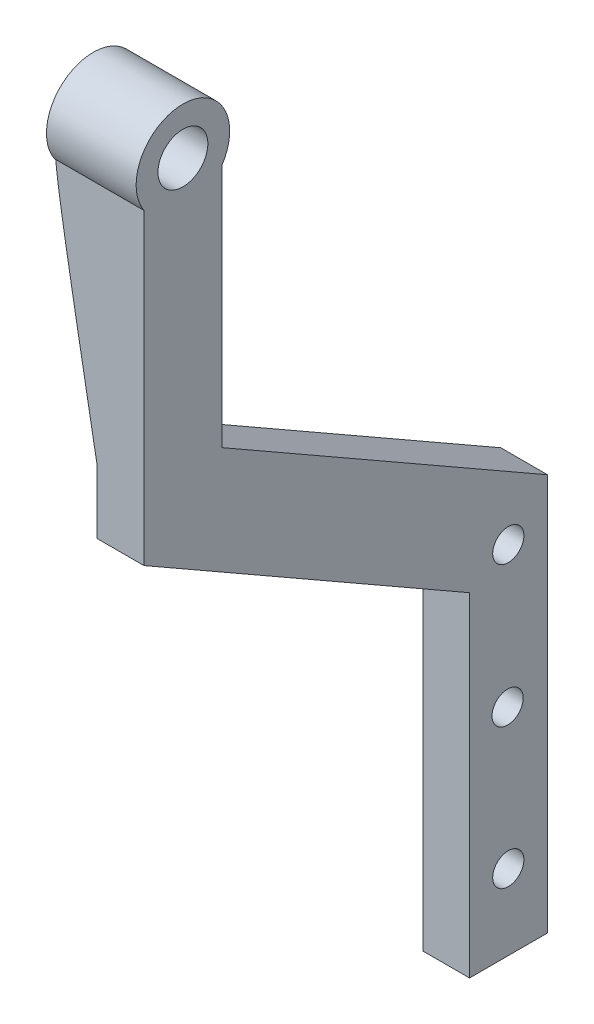
ISO-10303-21;
HEADER;
FILE_DESCRIPTION(('STEP AP214'),'2;1');
FILE_NAME('part.step','',(''),(''),'','','');
FILE_SCHEMA(('AUTOMOTIVE_DESIGN { 1 0 10303 214 1 1 1 1 }'));
ENDSEC;
DATA;
#1=APPLICATION_CONTEXT('core data for automotive mechanical design processes');
#2=APPLICATION_PROTOCOL_DEFINITION('international standard','automotive_design',2000,#1);
#3=PRODUCT_CONTEXT('',#1,'mechanical');
#4=PRODUCT('Part','Part','',(#3));
#5=PRODUCT_RELATED_PRODUCT_CATEGORY('part','',(#4));
#6=PRODUCT_DEFINITION_FORMATION('','',#4);
#7=PRODUCT_DEFINITION_CONTEXT('part definition',#1,'design');
#8=PRODUCT_DEFINITION('design','',#6,#7);
#9=PRODUCT_DEFINITION_SHAPE('','',#8);
#10=(LENGTH_UNIT() NAMED_UNIT(*) SI_UNIT(.MILLI.,.METRE.));
#11=(NAMED_UNIT(*) PLANE_ANGLE_UNIT() SI_UNIT($,.RADIAN.));
#12=(NAMED_UNIT(*) SI_UNIT($,.STERADIAN.) SOLID_ANGLE_UNIT());
#13=UNCERTAINTY_MEASURE_WITH_UNIT(LENGTH_MEASURE(1.E-05),#10,'distance_accuracy_value','');
#14=(GEOMETRIC_REPRESENTATION_CONTEXT(3) GLOBAL_UNCERTAINTY_ASSIGNED_CONTEXT((#13)) GLOBAL_UNIT_ASSIGNED_CONTEXT((#10,
#11,#12)) REPRESENTATION_CONTEXT('',''));
#15=CARTESIAN_POINT('',(0.,0.,0.));
#16=DIRECTION('',(0.,0.,1.));
#17=DIRECTION('',(1.,0.,0.));
#18=AXIS2_PLACEMENT_3D('',#15,#16,#17);
#19=CARTESIAN_POINT('',(25.7,0.,0.));
#20=DIRECTION('',(-1.,0.,0.));
#21=DIRECTION('',(0.,-1.,0.));
#22=AXIS2_PLACEMENT_3D('',#19,#20,#21);
#23=PLANE('',#22);
#24=CARTESIAN_POINT('',(25.7,0.,0.));
#25=DIRECTION('',(-1.,0.,0.));
#26=DIRECTION('',(0.,0.,1.));
#27=AXIS2_PLACEMENT_3D('',#24,#25,#26);
#28=CIRCLE('',#27,1.6);
#29=CARTESIAN_POINT('',(25.7,0.,1.6));
#30=VERTEX_POINT('',#29);
#31=EDGE_CURVE('E463',#30,#30,#28,.F.);
#32=ORIENTED_EDGE('',*,*,#31,.F.);
#33=EDGE_LOOP('',(#32));
#34=FACE_BOUND('',#33,.T.);
#35=CARTESIAN_POINT('',(25.7,-40.9017540160754,-20.8240395942605));
#36=DIRECTION('',(1.,0.,0.));
#37=DIRECTION('',(0.,-1.,0.));
#38=AXIS2_PLACEMENT_3D('',#35,#36,#37);
#39=CIRCLE('',#38,1.);
#40=CARTESIAN_POINT('',(25.7,-41.9017540160754,-20.8240395942605));
#41=VERTEX_POINT('',#40);
#42=EDGE_CURVE('E57',#41,#41,#39,.T.);
#43=ORIENTED_EDGE('',*,*,#42,.F.);
#44=EDGE_LOOP('',(#43));
#45=FACE_BOUND('',#44,.T.);
#46=CARTESIAN_POINT('',(25.7,-31.9018561460723,-20.8669153393056));
#47=DIRECTION('',(1.,0.,0.));
#48=DIRECTION('',(0.,-1.,0.));
#49=AXIS2_PLACEMENT_3D('',#46,#47,#48);
#50=CIRCLE('',#49,1.);
#51=CARTESIAN_POINT('',(25.7,-32.9018561460723,-20.8669153393056));
#52=VERTEX_POINT('',#51);
#53=EDGE_CURVE('E207',#52,#52,#50,.T.);
#54=ORIENTED_EDGE('',*,*,#53,.F.);
#55=EDGE_LOOP('',(#54));
#56=FACE_BOUND('',#55,.T.);
#57=CARTESIAN_POINT('',(25.7,-49.9016518860785,-20.8669153393056));
#58=DIRECTION('',(1.,0.,0.));
#59=DIRECTION('',(0.,-1.,0.));
#60=AXIS2_PLACEMENT_3D('',#57,#58,#59);
#61=CIRCLE('',#60,1.);
#62=CARTESIAN_POINT('',(25.7,-50.9016518860785,-20.8669153393056));
#63=VERTEX_POINT('',#62);
#64=EDGE_CURVE('E204',#63,#63,#61,.T.);
#65=ORIENTED_EDGE('',*,*,#64,.F.);
#66=EDGE_LOOP('',(#65));
#67=FACE_BOUND('',#66,.T.);
#68=DIRECTION('',(0.,-1.,0.));
#69=VECTOR('',#68,1.);
#70=CARTESIAN_POINT('',(25.7,0.,-2.5));
#71=LINE('',#70,#69);
#72=CARTESIAN_POINT('',(25.7,-1.6583123951777,-2.5));
#73=VERTEX_POINT('',#72);
#74=CARTESIAN_POINT('',(25.7,-17.3327342160877,-2.5));
#75=VERTEX_POINT('',#74);
#76=EDGE_CURVE('E50',#73,#75,#71,.T.);
#77=ORIENTED_EDGE('',*,*,#76,.F.);
#78=CARTESIAN_POINT('',(25.7,0.,0.));
#79=DIRECTION('',(-1.,0.,0.));
#80=DIRECTION('',(0.,0.,1.));
#81=AXIS2_PLACEMENT_3D('',#78,#79,#80);
#82=CIRCLE('',#81,3.);
#83=CARTESIAN_POINT('',(25.7,-1.6583123951777,2.5));
#84=VERTEX_POINT('',#83);
#85=EDGE_CURVE('E137',#73,#84,#82,.F.);
#86=ORIENTED_EDGE('',*,*,#85,.T.);
#87=DIRECTION('',(0.,-1.,0.));
#88=VECTOR('',#87,1.);
#89=CARTESIAN_POINT('',(25.7,0.,2.5));
#90=LINE('',#89,#88);
#91=CARTESIAN_POINT('',(25.7,-21.3847039769324,2.5));
#92=VERTEX_POINT('',#91);
#93=EDGE_CURVE('E73',#84,#92,#90,.T.);
#94=ORIENTED_EDGE('',*,*,#93,.T.);
#95=DIRECTION('',(0.,-0.496590024697171,-0.867985223014345));
#96=VECTOR('',#95,1.);
#97=CARTESIAN_POINT('',(25.7,-21.3847039769324,2.5));
#98=LINE('',#97,#96);
#99=CARTESIAN_POINT('',(25.7,-33.3326333912585,-18.3836780069791));
#100=VERTEX_POINT('',#99);
#101=EDGE_CURVE('E197',#92,#100,#98,.T.);
#102=ORIENTED_EDGE('',*,*,#101,.T.);
#103=DIRECTION('',(0.,-0.999999997476666,7.10399085624933E-05));
#104=VECTOR('',#103,1.);
#105=CARTESIAN_POINT('',(25.7,-33.3326333912585,-18.3836780069791));
#106=LINE('',#105,#104);
#107=CARTESIAN_POINT('',(25.7,-54.7309993874838,-18.3821578690115));
#108=VERTEX_POINT('',#107);
#109=EDGE_CURVE('E234',#100,#108,#106,.T.);
#110=ORIENTED_EDGE('',*,*,#109,.T.);
#111=DIRECTION('',(0.,-7.10399085587182E-05,-0.999999997476666));
#112=VECTOR('',#111,1.);
#113=CARTESIAN_POINT('',(25.7,-54.7309993874838,-18.3821578690115));
#114=LINE('',#113,#112);
#115=CARTESIAN_POINT('',(25.7,-54.7313545870266,-23.3821578563717));
#116=VERTEX_POINT('',#115);
#117=EDGE_CURVE('E236',#108,#116,#114,.T.);
#118=ORIENTED_EDGE('',*,*,#117,.T.);
#119=DIRECTION('',(0.,0.999999997476666,-7.10399089843637E-05));
#120=VECTOR('',#119,1.);
#121=CARTESIAN_POINT('',(25.7,-54.7313545870266,-23.3821578563717));
#122=LINE('',#121,#120);
#123=CARTESIAN_POINT('',(25.7,-29.2808283160098,-23.3839658594462));
#124=VERTEX_POINT('',#123);
#125=EDGE_CURVE('E239',#116,#124,#122,.T.);
#126=ORIENTED_EDGE('',*,*,#125,.T.);
#127=DIRECTION('',(0.,-0.496590024697171,-0.867985223014345));
#128=VECTOR('',#127,1.);
#129=CARTESIAN_POINT('',(25.7,-17.3327342160877,-2.5));
#130=LINE('',#129,#128);
#131=EDGE_CURVE('E228',#75,#124,#130,.T.);
#132=ORIENTED_EDGE('',*,*,#131,.F.);
#133=EDGE_LOOP('',(#77,#86,#94,#102,#110,#118,#126,#132));
#134=FACE_BOUND('',#133,.T.);
#135=ADVANCED_FACE('F47',(#34,#45,#56,#67,#134),#23,.F.);
#136=CARTESIAN_POINT('',(22.7,0.,0.));
#137=DIRECTION('',(-1.,0.,0.));
#138=DIRECTION('',(0.,-1.,0.));
#139=AXIS2_PLACEMENT_3D('',#136,#137,#138);
#140=PLANE('',#139);
#141=CARTESIAN_POINT('',(22.7,-40.9017540160754,-20.8240395942605));
#142=DIRECTION('',(1.,0.,0.));
#143=DIRECTION('',(0.,-1.,0.));
#144=AXIS2_PLACEMENT_3D('',#141,#142,#143);
#145=CIRCLE('',#144,1.);
#146=CARTESIAN_POINT('',(22.7,-41.9017540160754,-20.8240395942605));
#147=VERTEX_POINT('',#146);
#148=EDGE_CURVE('E244',#147,#147,#145,.T.);
#149=ORIENTED_EDGE('',*,*,#148,.T.);
#150=EDGE_LOOP('',(#149));
#151=FACE_BOUND('',#150,.T.);
#152=CARTESIAN_POINT('',(22.7,-31.9018561460723,-20.8669153393056));
#153=DIRECTION('',(1.,0.,0.));
#154=DIRECTION('',(0.,-1.,0.));
#155=AXIS2_PLACEMENT_3D('',#152,#153,#154);
#156=CIRCLE('',#155,1.);
#157=CARTESIAN_POINT('',(22.7,-32.9018561460723,-20.8669153393056));
#158=VERTEX_POINT('',#157);
#159=EDGE_CURVE('E248',#158,#158,#156,.T.);
#160=ORIENTED_EDGE('',*,*,#159,.T.);
#161=EDGE_LOOP('',(#160));
#162=FACE_BOUND('',#161,.T.);
#163=CARTESIAN_POINT('',(22.7,-49.9016518860785,-20.8669153393056));
#164=DIRECTION('',(1.,0.,0.));
#165=DIRECTION('',(0.,-1.,0.));
#166=AXIS2_PLACEMENT_3D('',#163,#164,#165);
#167=CIRCLE('',#166,1.);
#168=CARTESIAN_POINT('',(22.7,-50.9016518860785,-20.8669153393056));
#169=VERTEX_POINT('',#168);
#170=EDGE_CURVE('E252',#169,#169,#167,.T.);
#171=ORIENTED_EDGE('',*,*,#170,.T.);
#172=EDGE_LOOP('',(#171));
#173=FACE_BOUND('',#172,.T.);
#174=CARTESIAN_POINT('',(22.7,0.,0.));
#175=DIRECTION('',(-1.,0.,0.));
#176=DIRECTION('',(0.,-1.,0.));
#177=AXIS2_PLACEMENT_3D('',#174,#175,#176);
#178=CIRCLE('',#177,17.5);
#179=CARTESIAN_POINT('',(22.7,-17.3205080756888,-2.5));
#180=VERTEX_POINT('',#179);
#181=CARTESIAN_POINT('',(22.7,-17.3205080756888,2.5));
#182=VERTEX_POINT('',#181);
#183=EDGE_CURVE('E126',#180,#182,#178,.T.);
#184=ORIENTED_EDGE('',*,*,#183,.F.);
#185=DIRECTION('',(0.,-1.,0.));
#186=VECTOR('',#185,1.);
#187=CARTESIAN_POINT('',(22.7,0.,-2.5));
#188=LINE('',#187,#186);
#189=CARTESIAN_POINT('',(22.7,-17.3327342160877,-2.5));
#190=VERTEX_POINT('',#189);
#191=EDGE_CURVE('E258',#180,#190,#188,.T.);
#192=ORIENTED_EDGE('',*,*,#191,.T.);
#193=DIRECTION('',(0.,-0.496590024697171,-0.867985223014345));
#194=VECTOR('',#193,1.);
#195=CARTESIAN_POINT('',(22.7,-17.3327342160877,-2.5));
#196=LINE('',#195,#194);
#197=CARTESIAN_POINT('',(22.7,-29.2808283160098,-23.3839658594462));
#198=VERTEX_POINT('',#197);
#199=EDGE_CURVE('E261',#190,#198,#196,.T.);
#200=ORIENTED_EDGE('',*,*,#199,.T.);
#201=DIRECTION('',(0.,-0.999999997476666,7.10399089843637E-05));
#202=VECTOR('',#201,1.);
#203=CARTESIAN_POINT('',(22.7,-54.7313545870266,-23.3821578563717));
#204=LINE('',#203,#202);
#205=CARTESIAN_POINT('',(22.7,-54.7313545870266,-23.3821578563717));
#206=VERTEX_POINT('',#205);
#207=EDGE_CURVE('E264',#198,#206,#204,.T.);
#208=ORIENTED_EDGE('',*,*,#207,.T.);
#209=DIRECTION('',(0.,7.10399085587182E-05,0.999999997476666));
#210=VECTOR('',#209,1.);
#211=CARTESIAN_POINT('',(22.7,-54.7309993874838,-18.3821578690115));
#212=LINE('',#211,#210);
#213=CARTESIAN_POINT('',(22.7,-54.7309993874838,-18.3821578690115));
#214=VERTEX_POINT('',#213);
#215=EDGE_CURVE('E267',#206,#214,#212,.T.);
#216=ORIENTED_EDGE('',*,*,#215,.T.);
#217=DIRECTION('',(0.,0.999999997476666,-7.10399085624933E-05));
#218=VECTOR('',#217,1.);
#219=CARTESIAN_POINT('',(22.7,-33.3326333912585,-18.3836780069791));
#220=LINE('',#219,#218);
#221=CARTESIAN_POINT('',(22.7,-33.3326333912585,-18.3836780069791));
#222=VERTEX_POINT('',#221);
#223=EDGE_CURVE('E270',#214,#222,#220,.T.);
#224=ORIENTED_EDGE('',*,*,#223,.T.);
#225=DIRECTION('',(0.,0.496590024697171,0.867985223014345));
#226=VECTOR('',#225,1.);
#227=CARTESIAN_POINT('',(22.7,-21.3847039769324,2.5));
#228=LINE('',#227,#226);
#229=CARTESIAN_POINT('',(22.7,-21.3847039769324,2.5));
#230=VERTEX_POINT('',#229);
#231=EDGE_CURVE('E273',#222,#230,#228,.T.);
#232=ORIENTED_EDGE('',*,*,#231,.T.);
#233=DIRECTION('',(0.,1.,0.));
#234=VECTOR('',#233,1.);
#235=CARTESIAN_POINT('',(22.7,0.,2.5));
#236=LINE('',#235,#234);
#237=EDGE_CURVE('E276',#230,#182,#236,.T.);
#238=ORIENTED_EDGE('',*,*,#237,.T.);
#239=EDGE_LOOP('',(#184,#192,#200,#208,#216,#224,#232,#238));
#240=FACE_BOUND('',#239,.T.);
#241=ADVANCED_FACE('F221',(#151,#162,#173,#240),#140,.T.);
#242=CARTESIAN_POINT('',(25.7,0.,-2.5));
#243=DIRECTION('',(0.,0.,-1.));
#244=DIRECTION('',(0.,-1.,0.));
#245=AXIS2_PLACEMENT_3D('',#242,#243,#244);
#246=PLANE('',#245);
#247=DIRECTION('',(-1.,0.,0.));
#248=VECTOR('',#247,1.);
#249=CARTESIAN_POINT('',(34.1852813742386,-1.6583123951777,-2.5));
#250=LINE('',#249,#248);
#251=CARTESIAN_POINT('',(20.0416666666667,-1.6583123951777,-2.5));
#252=VERTEX_POINT('',#251);
#253=EDGE_CURVE('E65',#73,#252,#250,.T.);
#254=ORIENTED_EDGE('',*,*,#253,.F.);
#255=ORIENTED_EDGE('',*,*,#76,.T.);
#256=DIRECTION('',(-1.,0.,0.));
#257=VECTOR('',#256,1.);
#258=CARTESIAN_POINT('',(25.7,-17.3327342160877,-2.5));
#259=LINE('',#258,#257);
#260=EDGE_CURVE('E186',#75,#190,#259,.T.);
#261=ORIENTED_EDGE('',*,*,#260,.T.);
#262=ORIENTED_EDGE('',*,*,#191,.F.);
#263=CARTESIAN_POINT('',(19.95,0.,-2.5));
#264=CARTESIAN_POINT('',(19.95,-2.16506350946119,-2.5));
#265=CARTESIAN_POINT('',(22.7,-17.3205080756888,-2.5));
#266=(BOUNDED_CURVE() B_SPLINE_CURVE(2,(#263,#264,#265),.UNSPECIFIED.,.F.,
.F.) B_SPLINE_CURVE_WITH_KNOTS((3,3),(1.75452879508612,3.50905759017224),
.UNSPECIFIED.) CURVE() GEOMETRIC_REPRESENTATION_ITEM() RATIONAL_B_SPLINE_CURVE((1.,
1.99999999999986,1.)) REPRESENTATION_ITEM(''));
#267=EDGE_CURVE('E179',#252,#180,#266,.T.);
#268=ORIENTED_EDGE('',*,*,#267,.F.);
#269=EDGE_LOOP('',(#254,#255,#261,#262,#268));
#270=FACE_BOUND('',#269,.T.);
#271=ADVANCED_FACE('F282',(#270),#246,.T.);
#272=CARTESIAN_POINT('',(25.7,-17.3327342160877,-2.5));
#273=DIRECTION('',(0.,0.867985223014345,-0.496590024697171));
#274=DIRECTION('',(0.,-0.496590024697171,-0.867985223014345));
#275=AXIS2_PLACEMENT_3D('',#272,#273,#274);
#276=PLANE('',#275);
#277=ORIENTED_EDGE('',*,*,#131,.T.);
#278=DIRECTION('',(-1.,0.,0.));
#279=VECTOR('',#278,1.);
#280=CARTESIAN_POINT('',(25.7,-29.2808283160098,-23.3839658594462));
#281=LINE('',#280,#279);
#282=EDGE_CURVE('E173',#124,#198,#281,.T.);
#283=ORIENTED_EDGE('',*,*,#282,.T.);
#284=ORIENTED_EDGE('',*,*,#199,.F.);
#285=ORIENTED_EDGE('',*,*,#260,.F.);
#286=EDGE_LOOP('',(#277,#283,#284,#285));
#287=FACE_BOUND('',#286,.T.);
#288=ADVANCED_FACE('F284',(#287),#276,.T.);
#289=CARTESIAN_POINT('',(25.7,-29.2808283160098,-23.3839658594462));
#290=DIRECTION('',(0.,-7.10399089843637E-05,-0.999999997476666));
#291=DIRECTION('',(0.,-0.999999997476666,7.10399089843637E-05));
#292=AXIS2_PLACEMENT_3D('',#289,#290,#291);
#293=PLANE('',#292);
#294=ORIENTED_EDGE('',*,*,#125,.F.);
#295=DIRECTION('',(-1.,0.,0.));
#296=VECTOR('',#295,1.);
#297=CARTESIAN_POINT('',(25.7,-54.7313545870266,-23.3821578563717));
#298=LINE('',#297,#296);
#299=EDGE_CURVE('E167',#116,#206,#298,.T.);
#300=ORIENTED_EDGE('',*,*,#299,.T.);
#301=ORIENTED_EDGE('',*,*,#207,.F.);
#302=ORIENTED_EDGE('',*,*,#282,.F.);
#303=EDGE_LOOP('',(#294,#300,#301,#302));
#304=FACE_BOUND('',#303,.T.);
#305=ADVANCED_FACE('F305',(#304),#293,.T.);
#306=CARTESIAN_POINT('',(25.7,-54.7313545870266,-23.3821578563717));
#307=DIRECTION('',(0.,-0.999999997476666,7.10399085587182E-05));
#308=DIRECTION('',(0.,7.10399085587182E-05,0.999999997476666));
#309=AXIS2_PLACEMENT_3D('',#306,#307,#308);
#310=PLANE('',#309);
#311=ORIENTED_EDGE('',*,*,#117,.F.);
#312=DIRECTION('',(-1.,0.,0.));
#313=VECTOR('',#312,1.);
#314=CARTESIAN_POINT('',(25.7,-54.7309993874838,-18.3821578690115));
#315=LINE('',#314,#313);
#316=EDGE_CURVE('E161',#108,#214,#315,.T.);
#317=ORIENTED_EDGE('',*,*,#316,.T.);
#318=ORIENTED_EDGE('',*,*,#215,.F.);
#319=ORIENTED_EDGE('',*,*,#299,.F.);
#320=EDGE_LOOP('',(#311,#317,#318,#319));
#321=FACE_BOUND('',#320,.T.);
#322=ADVANCED_FACE('F301',(#321),#310,.T.);
#323=CARTESIAN_POINT('',(25.7,-54.7309993874838,-18.3821578690115));
#324=DIRECTION('',(0.,7.10399085624933E-05,0.999999997476666));
#325=DIRECTION('',(0.,0.999999997476666,-7.10399085624933E-05));
#326=AXIS2_PLACEMENT_3D('',#323,#324,#325);
#327=PLANE('',#326);
#328=ORIENTED_EDGE('',*,*,#109,.F.);
#329=DIRECTION('',(-1.,0.,0.));
#330=VECTOR('',#329,1.);
#331=CARTESIAN_POINT('',(25.7,-33.3326333912585,-18.3836780069791));
#332=LINE('',#331,#330);
#333=EDGE_CURVE('E155',#100,#222,#332,.T.);
#334=ORIENTED_EDGE('',*,*,#333,.T.);
#335=ORIENTED_EDGE('',*,*,#223,.F.);
#336=ORIENTED_EDGE('',*,*,#316,.F.);
#337=EDGE_LOOP('',(#328,#334,#335,#336));
#338=FACE_BOUND('',#337,.T.);
#339=ADVANCED_FACE('F297',(#338),#327,.T.);
#340=CARTESIAN_POINT('',(25.7,-33.3326333912585,-18.3836780069791));
#341=DIRECTION('',(0.,-0.867985223014345,0.496590024697171));
#342=DIRECTION('',(0.,0.496590024697171,0.867985223014345));
#343=AXIS2_PLACEMENT_3D('',#340,#341,#342);
#344=PLANE('',#343);
#345=ORIENTED_EDGE('',*,*,#101,.F.);
#346=DIRECTION('',(-1.,0.,0.));
#347=VECTOR('',#346,1.);
#348=CARTESIAN_POINT('',(25.7,-21.3847039769324,2.5));
#349=LINE('',#348,#347);
#350=EDGE_CURVE('E129',#92,#230,#349,.T.);
#351=ORIENTED_EDGE('',*,*,#350,.T.);
#352=ORIENTED_EDGE('',*,*,#231,.F.);
#353=ORIENTED_EDGE('',*,*,#333,.F.);
#354=EDGE_LOOP('',(#345,#351,#352,#353));
#355=FACE_BOUND('',#354,.T.);
#356=ADVANCED_FACE('F291',(#355),#344,.T.);
#357=CARTESIAN_POINT('',(25.7,-21.3847039769324,2.5));
#358=DIRECTION('',(0.,0.,1.));
#359=DIRECTION('',(0.,1.,0.));
#360=AXIS2_PLACEMENT_3D('',#357,#358,#359);
#361=PLANE('',#360);
#362=DIRECTION('',(-1.,0.,0.));
#363=VECTOR('',#362,1.);
#364=CARTESIAN_POINT('',(34.1852813742386,-1.6583123951777,2.5));
#365=LINE('',#364,#363);
#366=CARTESIAN_POINT('',(20.0416666666667,-1.6583123951777,2.5));
#367=VERTEX_POINT('',#366);
#368=EDGE_CURVE('E131',#367,#84,#365,.F.);
#369=ORIENTED_EDGE('',*,*,#368,.F.);
#370=CARTESIAN_POINT('',(22.7,-17.3205080756888,2.5));
#371=CARTESIAN_POINT('',(19.95,-2.16506350946116,2.5));
#372=CARTESIAN_POINT('',(19.95,0.,2.5));
#373=(BOUNDED_CURVE() B_SPLINE_CURVE(2,(#370,#371,#372),.UNSPECIFIED.,.F.,
.F.) B_SPLINE_CURVE_WITH_KNOTS((3,3),(0.,1.75452879508612),
.UNSPECIFIED.) CURVE() GEOMETRIC_REPRESENTATION_ITEM() RATIONAL_B_SPLINE_CURVE((1.,
1.99999999999984,1.)) REPRESENTATION_ITEM(''));
#374=EDGE_CURVE('E123',#182,#367,#373,.T.);
#375=ORIENTED_EDGE('',*,*,#374,.F.);
#376=ORIENTED_EDGE('',*,*,#237,.F.);
#377=ORIENTED_EDGE('',*,*,#350,.F.);
#378=ORIENTED_EDGE('',*,*,#93,.F.);
#379=EDGE_LOOP('',(#369,#375,#376,#377,#378));
#380=FACE_BOUND('',#379,.T.);
#381=ADVANCED_FACE('F132',(#380),#361,.T.);
#382=CARTESIAN_POINT('',(25.7,-49.9016518860785,-20.8669153393056));
#383=DIRECTION('',(-1.,0.,0.));
#384=DIRECTION('',(0.,-1.,0.));
#385=AXIS2_PLACEMENT_3D('',#382,#383,#384);
#386=CYLINDRICAL_SURFACE('',#385,1.);
#387=ORIENTED_EDGE('',*,*,#64,.T.);
#388=EDGE_LOOP('',(#387));
#389=FACE_BOUND('',#388,.T.);
#390=ORIENTED_EDGE('',*,*,#170,.F.);
#391=EDGE_LOOP('',(#390));
#392=FACE_BOUND('',#391,.T.);
#393=ADVANCED_FACE('F327',(#389,#392),#386,.F.);
#394=CARTESIAN_POINT('',(25.7,-31.9018561460723,-20.8669153393056));
#395=DIRECTION('',(-1.,0.,0.));
#396=DIRECTION('',(0.,-1.,0.));
#397=AXIS2_PLACEMENT_3D('',#394,#395,#396);
#398=CYLINDRICAL_SURFACE('',#397,1.);
#399=ORIENTED_EDGE('',*,*,#53,.T.);
#400=EDGE_LOOP('',(#399));
#401=FACE_BOUND('',#400,.T.);
#402=ORIENTED_EDGE('',*,*,#159,.F.);
#403=EDGE_LOOP('',(#402));
#404=FACE_BOUND('',#403,.T.);
#405=ADVANCED_FACE('F329',(#401,#404),#398,.F.);
#406=CARTESIAN_POINT('',(25.7,-40.9017540160754,-20.8240395942605));
#407=DIRECTION('',(-1.,0.,0.));
#408=DIRECTION('',(0.,-1.,0.));
#409=AXIS2_PLACEMENT_3D('',#406,#407,#408);
#410=CYLINDRICAL_SURFACE('',#409,1.);
#411=ORIENTED_EDGE('',*,*,#42,.T.);
#412=EDGE_LOOP('',(#411));
#413=FACE_BOUND('',#412,.T.);
#414=ORIENTED_EDGE('',*,*,#148,.F.);
#415=EDGE_LOOP('',(#414));
#416=FACE_BOUND('',#415,.T.);
#417=ADVANCED_FACE('F216',(#413,#416),#410,.F.);
#418=CARTESIAN_POINT('',(21.325,0.,0.));
#419=DIRECTION('',(1.,0.,0.));
#420=DIRECTION('',(0.,-1.,0.));
#421=AXIS2_PLACEMENT_3D('',#418,#419,#420);
#422=CONICAL_SURFACE('',#421,10.,1.38947655239341);
#423=CARTESIAN_POINT('',(20.0416666666667,0.,0.));
#424=DIRECTION('',(1.,0.,0.));
#425=DIRECTION('',(0.,0.,-1.));
#426=AXIS2_PLACEMENT_3D('',#423,#424,#425);
#427=CIRCLE('',#426,3.);
#428=EDGE_CURVE('E11',#252,#367,#427,.F.);
#429=ORIENTED_EDGE('',*,*,#428,.F.);
#430=ORIENTED_EDGE('',*,*,#267,.T.);
#431=ORIENTED_EDGE('',*,*,#183,.T.);
#432=ORIENTED_EDGE('',*,*,#374,.T.);
#433=EDGE_LOOP('',(#429,#430,#431,#432));
#434=FACE_BOUND('',#433,.T.);
#435=ADVANCED_FACE('F124',(#434),#422,.T.);
#436=CARTESIAN_POINT('',(34.1852813742386,0.,0.));
#437=DIRECTION('',(-1.,0.,0.));
#438=DIRECTION('',(0.,0.,1.));
#439=AXIS2_PLACEMENT_3D('',#436,#437,#438);
#440=CYLINDRICAL_SURFACE('',#439,3.);
#441=ORIENTED_EDGE('',*,*,#85,.F.);
#442=ORIENTED_EDGE('',*,*,#253,.T.);
#443=ORIENTED_EDGE('',*,*,#428,.T.);
#444=ORIENTED_EDGE('',*,*,#368,.T.);
#445=EDGE_LOOP('',(#441,#442,#443,#444));
#446=FACE_BOUND('',#445,.T.);
#447=CARTESIAN_POINT('',(19.95,0.,0.));
#448=DIRECTION('',(-1.,0.,0.));
#449=DIRECTION('',(0.,0.,1.));
#450=AXIS2_PLACEMENT_3D('',#447,#448,#449);
#451=CIRCLE('',#450,3.);
#452=CARTESIAN_POINT('',(19.95,0.,3.));
#453=VERTEX_POINT('',#452);
#454=EDGE_CURVE('E470',#453,#453,#451,.T.);
#455=ORIENTED_EDGE('',*,*,#454,.F.);
#456=EDGE_LOOP('',(#455));
#457=FACE_BOUND('',#456,.T.);
#458=ADVANCED_FACE('F139',(#446,#457),#440,.T.);
#459=CARTESIAN_POINT('',(19.95,0.,0.));
#460=DIRECTION('',(1.,0.,0.));
#461=DIRECTION('',(0.,1.,0.));
#462=AXIS2_PLACEMENT_3D('',#459,#460,#461);
#463=PLANE('',#462);
#464=CARTESIAN_POINT('',(19.95,0.,0.));
#465=DIRECTION('',(-1.,0.,0.));
#466=DIRECTION('',(0.,0.,1.));
#467=AXIS2_PLACEMENT_3D('',#464,#465,#466);
#468=CIRCLE('',#467,1.6);
#469=CARTESIAN_POINT('',(19.95,0.,1.6));
#470=VERTEX_POINT('',#469);
#471=EDGE_CURVE('E466',#470,#470,#468,.T.);
#472=ORIENTED_EDGE('',*,*,#471,.F.);
#473=EDGE_LOOP('',(#472));
#474=FACE_BOUND('',#473,.T.);
#475=ORIENTED_EDGE('',*,*,#454,.T.);
#476=EDGE_LOOP('',(#475));
#477=FACE_BOUND('',#476,.T.);
#478=ADVANCED_FACE('F379',(#474,#477),#463,.F.);
#479=CARTESIAN_POINT('',(30.2254833995939,0.,0.));
#480=DIRECTION('',(-1.,0.,0.));
#481=DIRECTION('',(0.,0.,1.));
#482=AXIS2_PLACEMENT_3D('',#479,#480,#481);
#483=CYLINDRICAL_SURFACE('',#482,1.6);
#484=CARTESIAN_POINT('',(25.7,0.,1.6));
#485=CARTESIAN_POINT('',(25.6401041666667,0.,1.6));
#486=CARTESIAN_POINT('',(25.5802083333333,0.,1.6));
#487=CARTESIAN_POINT('',(25.4604166666667,0.,1.6));
#488=CARTESIAN_POINT('',(25.4005208333333,0.,1.6));
#489=CARTESIAN_POINT('',(25.2807291666667,0.,1.6));
#490=CARTESIAN_POINT('',(25.2208333333333,0.,1.6));
#491=CARTESIAN_POINT('',(25.1010416666667,0.,1.6));
#492=CARTESIAN_POINT('',(25.0411458333333,0.,1.6));
#493=CARTESIAN_POINT('',(24.9213541666667,0.,1.6));
#494=CARTESIAN_POINT('',(24.8614583333333,0.,1.6));
#495=CARTESIAN_POINT('',(24.7416666666667,0.,1.6));
#496=CARTESIAN_POINT('',(24.6817708333333,0.,1.6));
#497=CARTESIAN_POINT('',(24.5619791666667,0.,1.6));
#498=CARTESIAN_POINT('',(24.5020833333333,0.,1.6));
#499=CARTESIAN_POINT('',(24.3822916666667,0.,1.6));
#500=CARTESIAN_POINT('',(24.3223958333333,0.,1.6));
#501=CARTESIAN_POINT('',(24.2026041666667,0.,1.6));
#502=CARTESIAN_POINT('',(24.1427083333333,0.,1.6));
#503=CARTESIAN_POINT('',(24.0229166666667,0.,1.6));
#504=CARTESIAN_POINT('',(23.9630208333333,0.,1.6));
#505=CARTESIAN_POINT('',(23.8432291666667,0.,1.6));
#506=CARTESIAN_POINT('',(23.7833333333333,0.,1.6));
#507=CARTESIAN_POINT('',(23.6635416666667,0.,1.6));
#508=CARTESIAN_POINT('',(23.6036458333333,0.,1.6));
#509=CARTESIAN_POINT('',(23.4838541666667,0.,1.6));
#510=CARTESIAN_POINT('',(23.4239583333333,0.,1.6));
#511=CARTESIAN_POINT('',(23.3041666666667,0.,1.6));
#512=CARTESIAN_POINT('',(23.2442708333333,0.,1.6));
#513=CARTESIAN_POINT('',(23.1244791666667,0.,1.6));
#514=CARTESIAN_POINT('',(23.0645833333333,0.,1.6));
#515=CARTESIAN_POINT('',(22.9447916666667,0.,1.6));
#516=CARTESIAN_POINT('',(22.8848958333333,0.,1.6));
#517=CARTESIAN_POINT('',(22.7651041666667,0.,1.6));
#518=CARTESIAN_POINT('',(22.7052083333333,0.,1.6));
#519=CARTESIAN_POINT('',(22.5854166666667,0.,1.6));
#520=CARTESIAN_POINT('',(22.5255208333333,0.,1.6));
#521=CARTESIAN_POINT('',(22.4057291666667,0.,1.6));
#522=CARTESIAN_POINT('',(22.3458333333333,0.,1.6));
#523=CARTESIAN_POINT('',(22.2260416666667,0.,1.6));
#524=CARTESIAN_POINT('',(22.1661458333333,0.,1.6));
#525=CARTESIAN_POINT('',(22.0463541666667,0.,1.6));
#526=CARTESIAN_POINT('',(21.9864583333333,0.,1.6));
#527=CARTESIAN_POINT('',(21.8666666666667,0.,1.6));
#528=CARTESIAN_POINT('',(21.8067708333333,0.,1.6));
#529=CARTESIAN_POINT('',(21.6869791666667,0.,1.6));
#530=CARTESIAN_POINT('',(21.6270833333333,0.,1.6));
#531=CARTESIAN_POINT('',(21.5072916666667,0.,1.6));
#532=CARTESIAN_POINT('',(21.4473958333333,0.,1.6));
#533=CARTESIAN_POINT('',(21.3276041666667,0.,1.6));
#534=CARTESIAN_POINT('',(21.2677083333333,0.,1.6));
#535=CARTESIAN_POINT('',(21.1479166666667,0.,1.6));
#536=CARTESIAN_POINT('',(21.0880208333333,0.,1.6));
#537=CARTESIAN_POINT('',(20.9682291666667,0.,1.6));
#538=CARTESIAN_POINT('',(20.9083333333333,0.,1.6));
#539=CARTESIAN_POINT('',(20.7885416666667,0.,1.6));
#540=CARTESIAN_POINT('',(20.7286458333333,0.,1.6));
#541=CARTESIAN_POINT('',(20.6088541666667,0.,1.6));
#542=CARTESIAN_POINT('',(20.5489583333333,0.,1.6));
#543=CARTESIAN_POINT('',(20.4291666666667,0.,1.6));
#544=CARTESIAN_POINT('',(20.3692708333333,0.,1.6));
#545=CARTESIAN_POINT('',(20.2494791666667,0.,1.6));
#546=CARTESIAN_POINT('',(20.1895833333333,0.,1.6));
#547=CARTESIAN_POINT('',(20.0697916666667,0.,1.6));
#548=CARTESIAN_POINT('',(20.0098958333333,0.,1.6));
#549=CARTESIAN_POINT('',(19.95,0.,1.6));
#550=B_SPLINE_CURVE_WITH_KNOTS('',3,(#484,#485,#486,#487,#488,#489,#490,#491,#492,#493,#494,
#495,#496,#497,#498,#499,#500,#501,#502,#503,#504,#505,#506,#507,#508,#509,#510,#511,#512,#513,
#514,#515,#516,#517,#518,#519,#520,#521,#522,#523,#524,#525,#526,#527,#528,#529,#530,#531,#532,
#533,#534,#535,#536,#537,#538,#539,#540,#541,#542,#543,#544,#545,#546,#547,#548,#549),
.UNSPECIFIED.,.F.,.F.,(4,2,2,2,2,2,2,2,2,2,2,2,2,2,2,2,2,2,2,2,2,2,2,2,2,2,2,2,2,2,2,2,4),(0.,
0.179687500000001,0.359375000000002,0.539062500000003,0.718750000000001,0.898437500000002,
1.078125,1.2578125,1.4375,1.6171875,1.796875,1.9765625,2.15625,2.3359375,2.515625,2.6953125,
2.875,3.0546875,3.234375,3.4140625,3.59375,3.7734375,3.95312500000001,4.1328125,4.3125,
4.4921875,4.671875,4.8515625,5.03125,5.2109375,5.390625,5.5703125,5.75),.UNSPECIFIED.);
#551=EDGE_CURVE('BSEAM396',#30,#470,#550,.T.);
#552=ORIENTED_EDGE('',*,*,#31,.T.);
#553=ORIENTED_EDGE('',*,*,#471,.T.);
#554=ORIENTED_EDGE('',*,*,#551,.T.);
#555=ORIENTED_EDGE('',*,*,#551,.F.);
#556=EDGE_LOOP('',(#552,#554,#553,#555));
#557=FACE_BOUND('',#556,.T.);
#558=ADVANCED_FACE('F396',(#557),#483,.F.);
#559=CLOSED_SHELL('',(#135,#241,#271,#288,#305,#322,#339,#356,#381,#393,#405,#417,#435,#458,
#478,#558));
#560=MANIFOLD_SOLID_BREP('B2',#559);
#561=ADVANCED_BREP_SHAPE_REPRESENTATION('',(#18,#560),#14);
#562=SHAPE_DEFINITION_REPRESENTATION(#9,#561);
ENDSEC;
END-ISO-10303-21;
